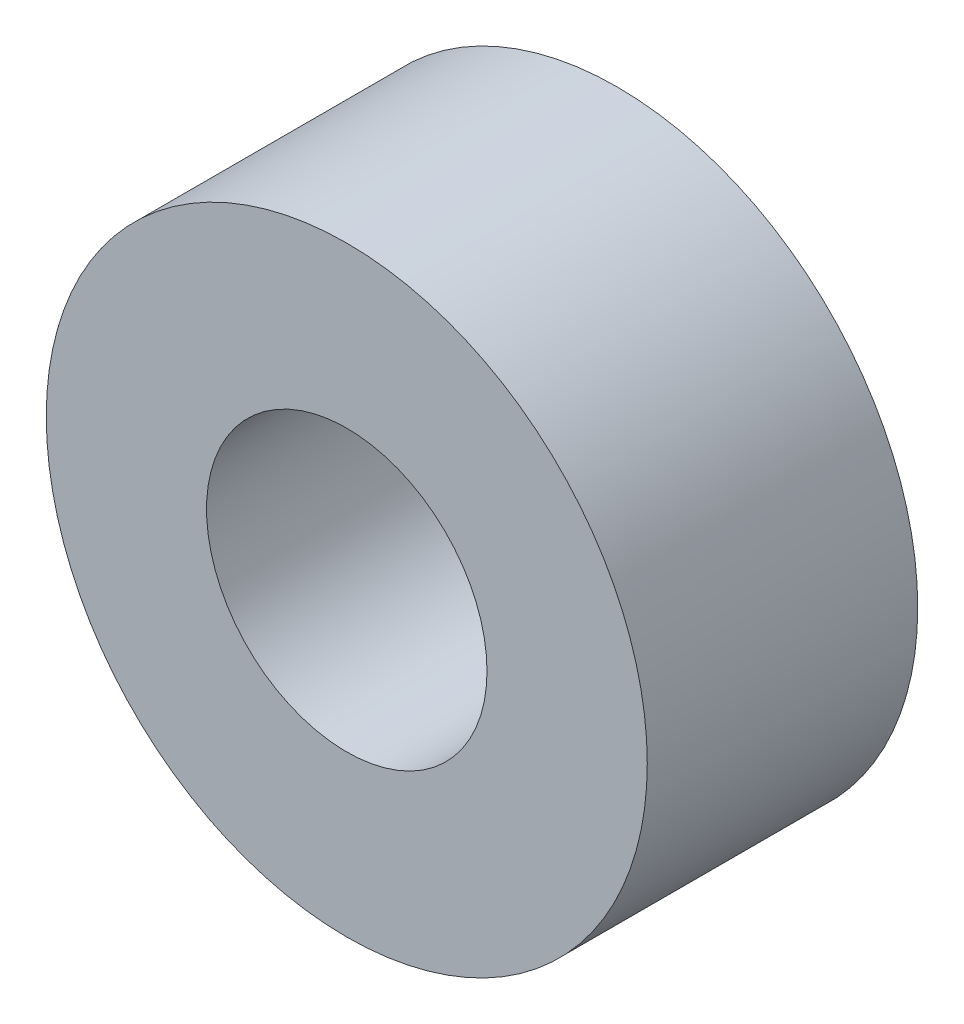
ISO-10303-21;
HEADER;
FILE_DESCRIPTION(('STEP AP214'),'2;1');
FILE_NAME('part.step','',(''),(''),'','','');
FILE_SCHEMA(('AUTOMOTIVE_DESIGN { 1 0 10303 214 1 1 1 1 }'));
ENDSEC;
DATA;
#1=APPLICATION_CONTEXT('core data for automotive mechanical design processes');
#2=APPLICATION_PROTOCOL_DEFINITION('international standard','automotive_design',2000,#1);
#3=PRODUCT_CONTEXT('',#1,'mechanical');
#4=PRODUCT('Part','Part','',(#3));
#5=PRODUCT_RELATED_PRODUCT_CATEGORY('part','',(#4));
#6=PRODUCT_DEFINITION_FORMATION('','',#4);
#7=PRODUCT_DEFINITION_CONTEXT('part definition',#1,'design');
#8=PRODUCT_DEFINITION('design','',#6,#7);
#9=PRODUCT_DEFINITION_SHAPE('','',#8);
#10=(LENGTH_UNIT() NAMED_UNIT(*) SI_UNIT(.MILLI.,.METRE.));
#11=(NAMED_UNIT(*) PLANE_ANGLE_UNIT() SI_UNIT($,.RADIAN.));
#12=(NAMED_UNIT(*) SI_UNIT($,.STERADIAN.) SOLID_ANGLE_UNIT());
#13=UNCERTAINTY_MEASURE_WITH_UNIT(LENGTH_MEASURE(1.E-05),#10,'distance_accuracy_value','');
#14=(GEOMETRIC_REPRESENTATION_CONTEXT(3) GLOBAL_UNCERTAINTY_ASSIGNED_CONTEXT((#13)) GLOBAL_UNIT_ASSIGNED_CONTEXT((#10,
#11,#12)) REPRESENTATION_CONTEXT('',''));
#15=CARTESIAN_POINT('',(0.,0.,0.));
#16=DIRECTION('',(0.,0.,1.));
#17=DIRECTION('',(1.,0.,0.));
#18=AXIS2_PLACEMENT_3D('',#15,#16,#17);
#19=CARTESIAN_POINT('',(0.,0.,2.));
#20=DIRECTION('',(0.,0.,1.));
#21=DIRECTION('',(1.,0.,0.));
#22=AXIS2_PLACEMENT_3D('',#19,#20,#21);
#23=PLANE('',#22);
#24=CARTESIAN_POINT('',(0.,0.,2.));
#25=DIRECTION('',(0.,0.,1.));
#26=DIRECTION('',(1.,0.,0.));
#27=AXIS2_PLACEMENT_3D('',#24,#25,#26);
#28=CIRCLE('',#27,60.);
#29=CARTESIAN_POINT('',(60.,0.,2.));
#30=VERTEX_POINT('',#29);
#31=EDGE_CURVE('E10',#30,#30,#28,.T.);
#32=ORIENTED_EDGE('',*,*,#31,.T.);
#33=EDGE_LOOP('',(#32));
#34=FACE_BOUND('',#33,.T.);
#35=CARTESIAN_POINT('',(0.,0.,2.));
#36=DIRECTION('',(0.,0.,1.));
#37=DIRECTION('',(1.,0.,0.));
#38=AXIS2_PLACEMENT_3D('',#35,#36,#37);
#39=CIRCLE('',#38,28.);
#40=CARTESIAN_POINT('',(28.,0.,2.));
#41=VERTEX_POINT('',#40);
#42=EDGE_CURVE('E35',#41,#41,#39,.T.);
#43=ORIENTED_EDGE('',*,*,#42,.F.);
#44=EDGE_LOOP('',(#43));
#45=FACE_BOUND('',#44,.T.);
#46=ADVANCED_FACE('F28',(#34,#45),#23,.T.);
#47=CARTESIAN_POINT('',(0.,0.,2.));
#48=DIRECTION('',(0.,0.,-1.));
#49=DIRECTION('',(-1.,0.,0.));
#50=AXIS2_PLACEMENT_3D('',#47,#48,#49);
#51=CYLINDRICAL_SURFACE('',#50,60.);
#52=ORIENTED_EDGE('',*,*,#31,.F.);
#53=EDGE_LOOP('',(#52));
#54=FACE_BOUND('',#53,.T.);
#55=CARTESIAN_POINT('',(0.,0.,-52.));
#56=DIRECTION('',(0.,0.,1.));
#57=DIRECTION('',(1.,0.,0.));
#58=AXIS2_PLACEMENT_3D('',#55,#56,#57);
#59=CIRCLE('',#58,60.);
#60=CARTESIAN_POINT('',(60.,0.,-52.));
#61=VERTEX_POINT('',#60);
#62=EDGE_CURVE('E39',#61,#61,#59,.T.);
#63=ORIENTED_EDGE('',*,*,#62,.T.);
#64=EDGE_LOOP('',(#63));
#65=FACE_BOUND('',#64,.T.);
#66=ADVANCED_FACE('F30',(#54,#65),#51,.T.);
#67=CARTESIAN_POINT('',(0.,0.,2.));
#68=DIRECTION('',(0.,0.,-1.));
#69=DIRECTION('',(-1.,0.,0.));
#70=AXIS2_PLACEMENT_3D('',#67,#68,#69);
#71=CYLINDRICAL_SURFACE('',#70,28.);
#72=ORIENTED_EDGE('',*,*,#42,.T.);
#73=EDGE_LOOP('',(#72));
#74=FACE_BOUND('',#73,.T.);
#75=CARTESIAN_POINT('',(0.,0.,-52.));
#76=DIRECTION('',(0.,0.,1.));
#77=DIRECTION('',(1.,0.,0.));
#78=AXIS2_PLACEMENT_3D('',#75,#76,#77);
#79=CIRCLE('',#78,28.);
#80=CARTESIAN_POINT('',(28.,0.,-52.));
#81=VERTEX_POINT('',#80);
#82=EDGE_CURVE('E43',#81,#81,#79,.T.);
#83=ORIENTED_EDGE('',*,*,#82,.F.);
#84=EDGE_LOOP('',(#83));
#85=FACE_BOUND('',#84,.T.);
#86=ADVANCED_FACE('F52',(#74,#85),#71,.F.);
#87=CARTESIAN_POINT('',(0.,0.,-52.));
#88=DIRECTION('',(0.,0.,1.));
#89=DIRECTION('',(1.,0.,0.));
#90=AXIS2_PLACEMENT_3D('',#87,#88,#89);
#91=PLANE('',#90);
#92=ORIENTED_EDGE('',*,*,#82,.T.);
#93=EDGE_LOOP('',(#92));
#94=FACE_BOUND('',#93,.T.);
#95=ORIENTED_EDGE('',*,*,#62,.F.);
#96=EDGE_LOOP('',(#95));
#97=FACE_BOUND('',#96,.T.);
#98=ADVANCED_FACE('F49',(#94,#97),#91,.F.);
#99=CLOSED_SHELL('',(#46,#66,#86,#98));
#100=MANIFOLD_SOLID_BREP('B2',#99);
#101=ADVANCED_BREP_SHAPE_REPRESENTATION('',(#18,#100),#14);
#102=SHAPE_DEFINITION_REPRESENTATION(#9,#101);
ENDSEC;
END-ISO-10303-21;
